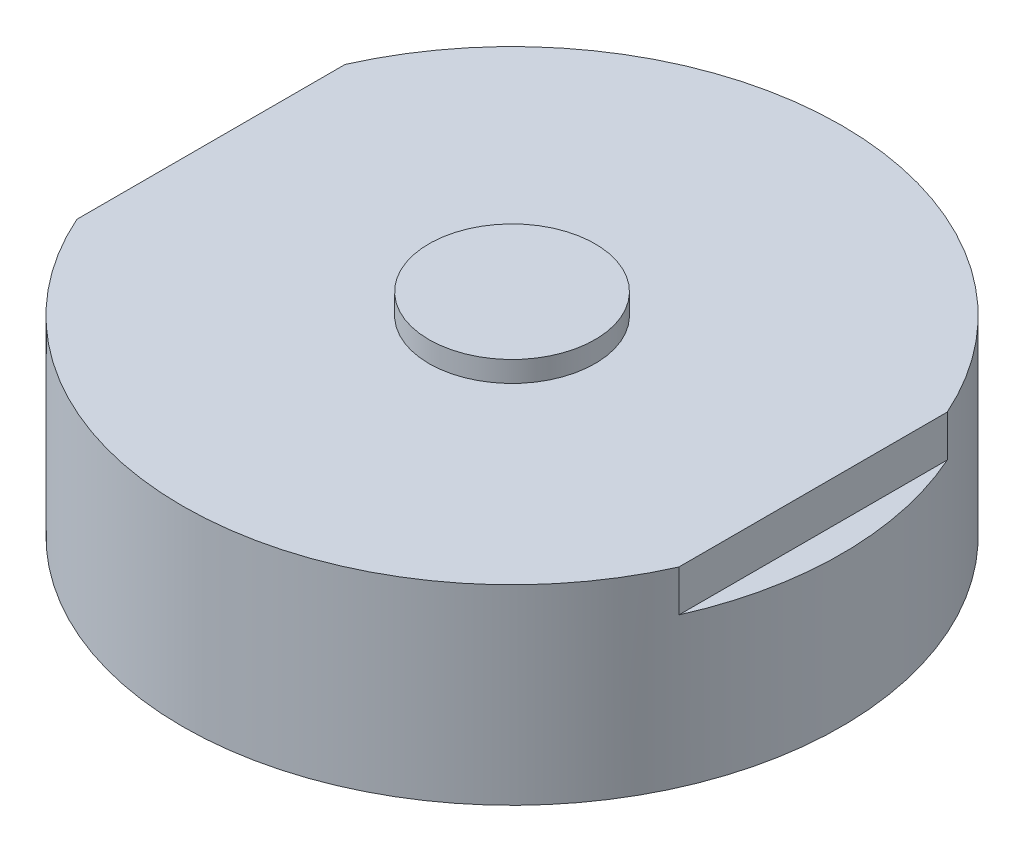
ISO-10303-21;
HEADER;
FILE_DESCRIPTION(('STEP AP214'),'2;1');
FILE_NAME('part.step','',(''),(''),'','','');
FILE_SCHEMA(('AUTOMOTIVE_DESIGN { 1 0 10303 214 1 1 1 1 }'));
ENDSEC;
DATA;
#1=APPLICATION_CONTEXT('core data for automotive mechanical design processes');
#2=APPLICATION_PROTOCOL_DEFINITION('international standard','automotive_design',2000,#1);
#3=PRODUCT_CONTEXT('',#1,'mechanical');
#4=PRODUCT('Part','Part','',(#3));
#5=PRODUCT_RELATED_PRODUCT_CATEGORY('part','',(#4));
#6=PRODUCT_DEFINITION_FORMATION('','',#4);
#7=PRODUCT_DEFINITION_CONTEXT('part definition',#1,'design');
#8=PRODUCT_DEFINITION('design','',#6,#7);
#9=PRODUCT_DEFINITION_SHAPE('','',#8);
#10=(LENGTH_UNIT() NAMED_UNIT(*) SI_UNIT(.MILLI.,.METRE.));
#11=(NAMED_UNIT(*) PLANE_ANGLE_UNIT() SI_UNIT($,.RADIAN.));
#12=(NAMED_UNIT(*) SI_UNIT($,.STERADIAN.) SOLID_ANGLE_UNIT());
#13=UNCERTAINTY_MEASURE_WITH_UNIT(LENGTH_MEASURE(1.E-05),#10,'distance_accuracy_value','');
#14=(GEOMETRIC_REPRESENTATION_CONTEXT(3) GLOBAL_UNCERTAINTY_ASSIGNED_CONTEXT((#13)) GLOBAL_UNIT_ASSIGNED_CONTEXT((#10,
#11,#12)) REPRESENTATION_CONTEXT('',''));
#15=CARTESIAN_POINT('',(0.,0.,0.));
#16=DIRECTION('',(0.,0.,1.));
#17=DIRECTION('',(1.,0.,0.));
#18=AXIS2_PLACEMENT_3D('',#15,#16,#17);
#19=CARTESIAN_POINT('',(0.,9.2,0.));
#20=DIRECTION('',(0.,-1.,0.));
#21=DIRECTION('',(0.,0.,-1.));
#22=AXIS2_PLACEMENT_3D('',#19,#20,#21);
#23=CYLINDRICAL_SURFACE('',#22,15.875);
#24=CARTESIAN_POINT('',(0.,9.2,0.));
#25=DIRECTION('',(0.,1.,0.));
#26=DIRECTION('',(0.,0.,1.));
#27=AXIS2_PLACEMENT_3D('',#24,#25,#26);
#28=CIRCLE('',#27,15.875);
#29=CARTESIAN_POINT('',(-14.5,9.2,6.46263297735528));
#30=VERTEX_POINT('',#29);
#31=CARTESIAN_POINT('',(14.5,9.2,6.46263297735529));
#32=VERTEX_POINT('',#31);
#33=EDGE_CURVE('E89',#30,#32,#28,.T.);
#34=ORIENTED_EDGE('',*,*,#33,.F.);
#35=DIRECTION('',(0.,-1.,0.));
#36=VECTOR('',#35,1.);
#37=CARTESIAN_POINT('',(-14.5,9.2,6.46263297735528));
#38=LINE('',#37,#36);
#39=CARTESIAN_POINT('',(-14.5,7.2,6.46263297735528));
#40=VERTEX_POINT('',#39);
#41=EDGE_CURVE('E48',#30,#40,#38,.T.);
#42=ORIENTED_EDGE('',*,*,#41,.T.);
#43=CARTESIAN_POINT('',(0.,7.2,0.));
#44=DIRECTION('',(0.,1.,0.));
#45=DIRECTION('',(0.,0.,1.));
#46=AXIS2_PLACEMENT_3D('',#43,#44,#45);
#47=CIRCLE('',#46,15.875);
#48=CARTESIAN_POINT('',(-14.5,7.2,-6.46263297735528));
#49=VERTEX_POINT('',#48);
#50=EDGE_CURVE('E36',#49,#40,#47,.T.);
#51=ORIENTED_EDGE('',*,*,#50,.F.);
#52=DIRECTION('',(0.,-1.,0.));
#53=VECTOR('',#52,1.);
#54=CARTESIAN_POINT('',(-14.5,9.2,-6.46263297735528));
#55=LINE('',#54,#53);
#56=CARTESIAN_POINT('',(-14.5,9.2,-6.46263297735528));
#57=VERTEX_POINT('',#56);
#58=EDGE_CURVE('E107',#49,#57,#55,.F.);
#59=ORIENTED_EDGE('',*,*,#58,.T.);
#60=CARTESIAN_POINT('',(14.5,9.2,-6.46263297735529));
#61=VERTEX_POINT('',#60);
#62=EDGE_CURVE('E83',#61,#57,#28,.T.);
#63=ORIENTED_EDGE('',*,*,#62,.F.);
#64=DIRECTION('',(0.,-1.,0.));
#65=VECTOR('',#64,1.);
#66=CARTESIAN_POINT('',(14.5,9.2,-6.46263297735529));
#67=LINE('',#66,#65);
#68=CARTESIAN_POINT('',(14.5,7.2,-6.46263297735529));
#69=VERTEX_POINT('',#68);
#70=EDGE_CURVE('E56',#61,#69,#67,.T.);
#71=ORIENTED_EDGE('',*,*,#70,.T.);
#72=CARTESIAN_POINT('',(0.,7.2,0.));
#73=DIRECTION('',(0.,-1.,0.));
#74=DIRECTION('',(0.,0.,-1.));
#75=AXIS2_PLACEMENT_3D('',#72,#73,#74);
#76=CIRCLE('',#75,15.875);
#77=CARTESIAN_POINT('',(14.5,7.2,6.46263297735528));
#78=VERTEX_POINT('',#77);
#79=EDGE_CURVE('E90',#69,#78,#76,.T.);
#80=ORIENTED_EDGE('',*,*,#79,.T.);
#81=DIRECTION('',(0.,-1.,0.));
#82=VECTOR('',#81,1.);
#83=CARTESIAN_POINT('',(14.5,9.2,6.46263297735528));
#84=LINE('',#83,#82);
#85=EDGE_CURVE('E76',#78,#32,#84,.F.);
#86=ORIENTED_EDGE('',*,*,#85,.T.);
#87=EDGE_LOOP('',(#34,#42,#51,#59,#63,#71,#80,#86));
#88=FACE_BOUND('',#87,.T.);
#89=CARTESIAN_POINT('',(0.,0.,0.));
#90=DIRECTION('',(0.,1.,0.));
#91=DIRECTION('',(0.,0.,1.));
#92=AXIS2_PLACEMENT_3D('',#89,#90,#91);
#93=CIRCLE('',#92,15.875);
#94=CARTESIAN_POINT('',(0.,0.,15.875));
#95=VERTEX_POINT('',#94);
#96=EDGE_CURVE('E94',#95,#95,#93,.T.);
#97=ORIENTED_EDGE('',*,*,#96,.T.);
#98=EDGE_LOOP('',(#97));
#99=FACE_BOUND('',#98,.T.);
#100=ADVANCED_FACE('F33',(#88,#99),#23,.T.);
#101=CARTESIAN_POINT('',(0.,9.2,0.));
#102=DIRECTION('',(0.,1.,0.));
#103=DIRECTION('',(0.,0.,1.));
#104=AXIS2_PLACEMENT_3D('',#101,#102,#103);
#105=PLANE('',#104);
#106=CARTESIAN_POINT('',(0.,9.2,0.));
#107=DIRECTION('',(0.,1.,0.));
#108=DIRECTION('',(0.,0.,1.));
#109=AXIS2_PLACEMENT_3D('',#106,#107,#108);
#110=CIRCLE('',#109,4.);
#111=CARTESIAN_POINT('',(0.,9.2,4.));
#112=VERTEX_POINT('',#111);
#113=EDGE_CURVE('E11',#112,#112,#110,.T.);
#114=ORIENTED_EDGE('',*,*,#113,.F.);
#115=EDGE_LOOP('',(#114));
#116=FACE_BOUND('',#115,.T.);
#117=DIRECTION('',(0.,0.,-1.));
#118=VECTOR('',#117,1.);
#119=CARTESIAN_POINT('',(-14.5,9.2,0.));
#120=LINE('',#119,#118);
#121=EDGE_CURVE('E82',#30,#57,#120,.T.);
#122=ORIENTED_EDGE('',*,*,#121,.F.);
#123=ORIENTED_EDGE('',*,*,#33,.T.);
#124=DIRECTION('',(0.,0.,1.));
#125=VECTOR('',#124,1.);
#126=CARTESIAN_POINT('',(14.5,9.2,0.));
#127=LINE('',#126,#125);
#128=EDGE_CURVE('E73',#61,#32,#127,.T.);
#129=ORIENTED_EDGE('',*,*,#128,.F.);
#130=ORIENTED_EDGE('',*,*,#62,.T.);
#131=EDGE_LOOP('',(#122,#123,#129,#130));
#132=FACE_BOUND('',#131,.T.);
#133=ADVANCED_FACE('F93',(#116,#132),#105,.T.);
#134=CARTESIAN_POINT('',(0.,0.,0.));
#135=DIRECTION('',(0.,1.,0.));
#136=DIRECTION('',(0.,0.,1.));
#137=AXIS2_PLACEMENT_3D('',#134,#135,#136);
#138=PLANE('',#137);
#139=CARTESIAN_POINT('',(0.,0.,-12.7));
#140=DIRECTION('',(0.,-1.,0.));
#141=DIRECTION('',(0.,0.,-1.));
#142=AXIS2_PLACEMENT_3D('',#139,#140,#141);
#143=CIRCLE('',#142,1.7);
#144=CARTESIAN_POINT('',(0.,0.,-14.4));
#145=VERTEX_POINT('',#144);
#146=EDGE_CURVE('E123',#145,#145,#143,.T.);
#147=ORIENTED_EDGE('',*,*,#146,.F.);
#148=EDGE_LOOP('',(#147));
#149=FACE_BOUND('',#148,.T.);
#150=CARTESIAN_POINT('',(0.,0.,12.7));
#151=DIRECTION('',(0.,-1.,0.));
#152=DIRECTION('',(0.,0.,1.));
#153=AXIS2_PLACEMENT_3D('',#150,#151,#152);
#154=CIRCLE('',#153,1.7);
#155=CARTESIAN_POINT('',(0.,0.,14.4));
#156=VERTEX_POINT('',#155);
#157=EDGE_CURVE('E117',#156,#156,#154,.T.);
#158=ORIENTED_EDGE('',*,*,#157,.F.);
#159=EDGE_LOOP('',(#158));
#160=FACE_BOUND('',#159,.T.);
#161=ORIENTED_EDGE('',*,*,#96,.F.);
#162=EDGE_LOOP('',(#161));
#163=FACE_BOUND('',#162,.T.);
#164=ADVANCED_FACE('F138',(#149,#160,#163),#138,.F.);
#165=CARTESIAN_POINT('',(0.,7.2,0.));
#166=DIRECTION('',(0.,-1.,0.));
#167=DIRECTION('',(0.,0.,-1.));
#168=AXIS2_PLACEMENT_3D('',#165,#166,#167);
#169=PLANE('',#168);
#170=DIRECTION('',(0.,0.,1.));
#171=VECTOR('',#170,1.);
#172=CARTESIAN_POINT('',(14.5,7.2,-7.29881644941344));
#173=LINE('',#172,#171);
#174=EDGE_CURVE('E108',#69,#78,#173,.T.);
#175=ORIENTED_EDGE('',*,*,#174,.T.);
#176=ORIENTED_EDGE('',*,*,#79,.F.);
#177=EDGE_LOOP('',(#175,#176));
#178=FACE_BOUND('',#177,.T.);
#179=ADVANCED_FACE('F141',(#178),#169,.F.);
#180=CARTESIAN_POINT('',(14.5,7.2,-7.29881644941344));
#181=DIRECTION('',(-1.,0.,0.));
#182=DIRECTION('',(0.,0.,1.));
#183=AXIS2_PLACEMENT_3D('',#180,#181,#182);
#184=PLANE('',#183);
#185=ORIENTED_EDGE('',*,*,#128,.T.);
#186=ORIENTED_EDGE('',*,*,#85,.F.);
#187=ORIENTED_EDGE('',*,*,#174,.F.);
#188=ORIENTED_EDGE('',*,*,#70,.F.);
#189=EDGE_LOOP('',(#185,#186,#187,#188));
#190=FACE_BOUND('',#189,.T.);
#191=ADVANCED_FACE('F75',(#190),#184,.F.);
#192=CARTESIAN_POINT('',(0.,7.2,0.));
#193=DIRECTION('',(0.,1.,0.));
#194=DIRECTION('',(0.,0.,1.));
#195=AXIS2_PLACEMENT_3D('',#192,#193,#194);
#196=PLANE('',#195);
#197=ORIENTED_EDGE('',*,*,#50,.T.);
#198=DIRECTION('',(0.,0.,-1.));
#199=VECTOR('',#198,1.);
#200=CARTESIAN_POINT('',(-14.5,7.2,-7.29881644941343));
#201=LINE('',#200,#199);
#202=EDGE_CURVE('E91',#40,#49,#201,.T.);
#203=ORIENTED_EDGE('',*,*,#202,.T.);
#204=EDGE_LOOP('',(#197,#203));
#205=FACE_BOUND('',#204,.T.);
#206=ADVANCED_FACE('F104',(#205),#196,.T.);
#207=CARTESIAN_POINT('',(-14.5,7.2,-7.29881644941343));
#208=DIRECTION('',(1.,0.,0.));
#209=DIRECTION('',(0.,0.,-1.));
#210=AXIS2_PLACEMENT_3D('',#207,#208,#209);
#211=PLANE('',#210);
#212=ORIENTED_EDGE('',*,*,#121,.T.);
#213=ORIENTED_EDGE('',*,*,#58,.F.);
#214=ORIENTED_EDGE('',*,*,#202,.F.);
#215=ORIENTED_EDGE('',*,*,#41,.F.);
#216=EDGE_LOOP('',(#212,#213,#214,#215));
#217=FACE_BOUND('',#216,.T.);
#218=ADVANCED_FACE('F106',(#217),#211,.F.);
#219=CARTESIAN_POINT('',(0.,10.2,0.));
#220=DIRECTION('',(0.,-1.,0.));
#221=DIRECTION('',(0.,0.,-1.));
#222=AXIS2_PLACEMENT_3D('',#219,#220,#221);
#223=CYLINDRICAL_SURFACE('',#222,4.);
#224=CARTESIAN_POINT('',(0.,10.2,0.));
#225=DIRECTION('',(0.,1.,0.));
#226=DIRECTION('',(0.,0.,1.));
#227=AXIS2_PLACEMENT_3D('',#224,#225,#226);
#228=CIRCLE('',#227,4.);
#229=CARTESIAN_POINT('',(0.,10.2,4.));
#230=VERTEX_POINT('',#229);
#231=EDGE_CURVE('E112',#230,#230,#228,.T.);
#232=ORIENTED_EDGE('',*,*,#231,.F.);
#233=EDGE_LOOP('',(#232));
#234=FACE_BOUND('',#233,.T.);
#235=ORIENTED_EDGE('',*,*,#113,.T.);
#236=EDGE_LOOP('',(#235));
#237=FACE_BOUND('',#236,.T.);
#238=ADVANCED_FACE('F162',(#234,#237),#223,.T.);
#239=CARTESIAN_POINT('',(0.,10.2,0.));
#240=DIRECTION('',(0.,1.,0.));
#241=DIRECTION('',(0.,0.,1.));
#242=AXIS2_PLACEMENT_3D('',#239,#240,#241);
#243=PLANE('',#242);
#244=ORIENTED_EDGE('',*,*,#231,.T.);
#245=EDGE_LOOP('',(#244));
#246=FACE_BOUND('',#245,.T.);
#247=ADVANCED_FACE('F167',(#246),#243,.T.);
#248=CARTESIAN_POINT('',(0.,5.,12.7));
#249=DIRECTION('',(0.,-1.,0.));
#250=DIRECTION('',(0.,0.,-1.));
#251=AXIS2_PLACEMENT_3D('',#248,#249,#250);
#252=CYLINDRICAL_SURFACE('',#251,1.7);
#253=CARTESIAN_POINT('',(0.,5.,12.7));
#254=DIRECTION('',(0.,-1.,0.));
#255=DIRECTION('',(0.,0.,1.));
#256=AXIS2_PLACEMENT_3D('',#253,#254,#255);
#257=CIRCLE('',#256,1.7);
#258=CARTESIAN_POINT('',(0.,5.,14.4));
#259=VERTEX_POINT('',#258);
#260=EDGE_CURVE('E120',#259,#259,#257,.T.);
#261=ORIENTED_EDGE('',*,*,#260,.F.);
#262=EDGE_LOOP('',(#261));
#263=FACE_BOUND('',#262,.T.);
#264=ORIENTED_EDGE('',*,*,#157,.T.);
#265=EDGE_LOOP('',(#264));
#266=FACE_BOUND('',#265,.T.);
#267=ADVANCED_FACE('F171',(#263,#266),#252,.F.);
#268=CARTESIAN_POINT('',(0.,5.,12.7));
#269=DIRECTION('',(0.,1.,0.));
#270=DIRECTION('',(0.,0.,1.));
#271=AXIS2_PLACEMENT_3D('',#268,#269,#270);
#272=PLANE('',#271);
#273=ORIENTED_EDGE('',*,*,#260,.T.);
#274=EDGE_LOOP('',(#273));
#275=FACE_BOUND('',#274,.T.);
#276=ADVANCED_FACE('F134',(#275),#272,.F.);
#277=CARTESIAN_POINT('',(0.,5.,-12.7));
#278=DIRECTION('',(0.,-1.,0.));
#279=DIRECTION('',(0.,0.,-1.));
#280=AXIS2_PLACEMENT_3D('',#277,#278,#279);
#281=CYLINDRICAL_SURFACE('',#280,1.7);
#282=CARTESIAN_POINT('',(0.,5.,-12.7));
#283=DIRECTION('',(0.,-1.,0.));
#284=DIRECTION('',(0.,0.,-1.));
#285=AXIS2_PLACEMENT_3D('',#282,#283,#284);
#286=CIRCLE('',#285,1.7);
#287=CARTESIAN_POINT('',(0.,5.,-14.4));
#288=VERTEX_POINT('',#287);
#289=EDGE_CURVE('E116',#288,#288,#286,.T.);
#290=ORIENTED_EDGE('',*,*,#289,.F.);
#291=EDGE_LOOP('',(#290));
#292=FACE_BOUND('',#291,.T.);
#293=ORIENTED_EDGE('',*,*,#146,.T.);
#294=EDGE_LOOP('',(#293));
#295=FACE_BOUND('',#294,.T.);
#296=ADVANCED_FACE('F131',(#292,#295),#281,.F.);
#297=CARTESIAN_POINT('',(0.,5.,-12.7));
#298=DIRECTION('',(0.,-1.,0.));
#299=DIRECTION('',(0.,0.,-1.));
#300=AXIS2_PLACEMENT_3D('',#297,#298,#299);
#301=PLANE('',#300);
#302=ORIENTED_EDGE('',*,*,#289,.T.);
#303=EDGE_LOOP('',(#302));
#304=FACE_BOUND('',#303,.T.);
#305=ADVANCED_FACE('F129',(#304),#301,.T.);
#306=CLOSED_SHELL('',(#100,#133,#164,#179,#191,#206,#218,#238,#247,#267,#276,#296,#305));
#307=MANIFOLD_SOLID_BREP('B2',#306);
#308=ADVANCED_BREP_SHAPE_REPRESENTATION('',(#18,#307),#14);
#309=SHAPE_DEFINITION_REPRESENTATION(#9,#308);
ENDSEC;
END-ISO-10303-21;
